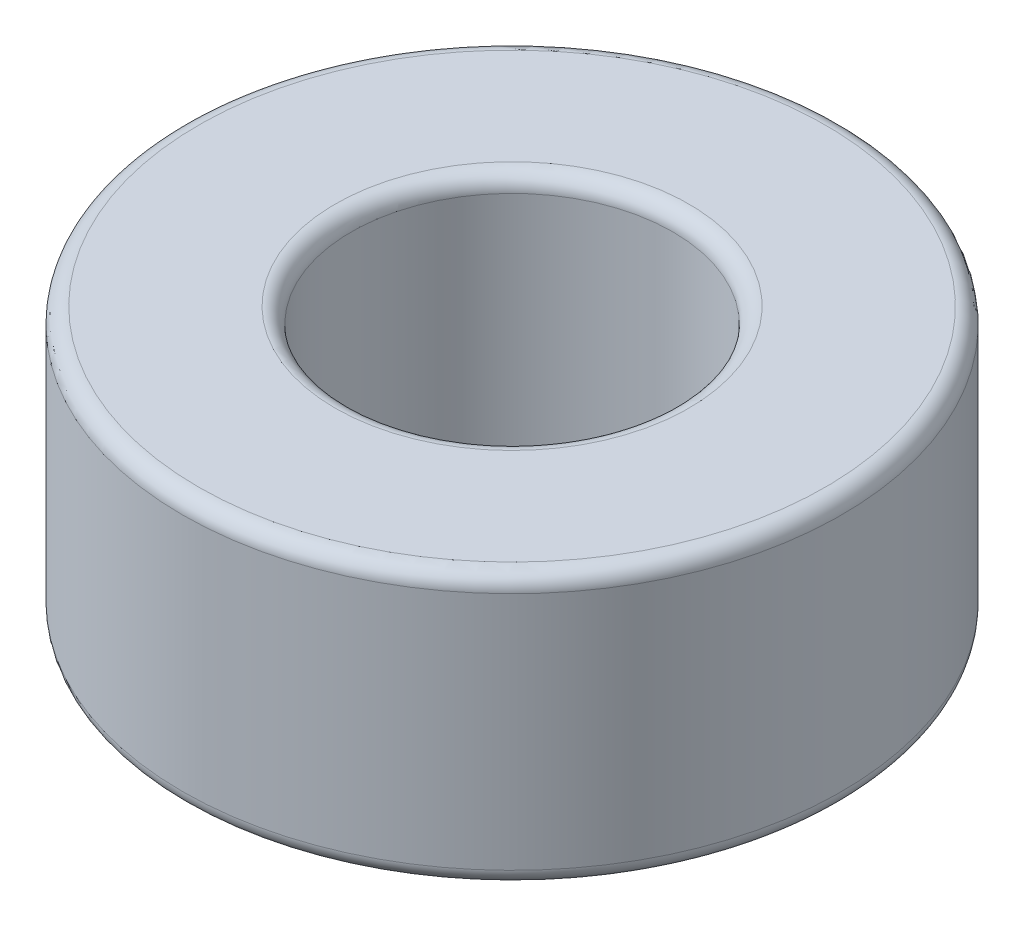
ISO-10303-21;
HEADER;
FILE_DESCRIPTION(('STEP AP214'),'2;1');
FILE_NAME('part.step','',(''),(''),'','','');
FILE_SCHEMA(('AUTOMOTIVE_DESIGN { 1 0 10303 214 1 1 1 1 }'));
ENDSEC;
DATA;
#1=APPLICATION_CONTEXT('core data for automotive mechanical design processes');
#2=APPLICATION_PROTOCOL_DEFINITION('international standard','automotive_design',2000,#1);
#3=PRODUCT_CONTEXT('',#1,'mechanical');
#4=PRODUCT('Part','Part','',(#3));
#5=PRODUCT_RELATED_PRODUCT_CATEGORY('part','',(#4));
#6=PRODUCT_DEFINITION_FORMATION('','',#4);
#7=PRODUCT_DEFINITION_CONTEXT('part definition',#1,'design');
#8=PRODUCT_DEFINITION('design','',#6,#7);
#9=PRODUCT_DEFINITION_SHAPE('','',#8);
#10=(LENGTH_UNIT() NAMED_UNIT(*) SI_UNIT(.MILLI.,.METRE.));
#11=(NAMED_UNIT(*) PLANE_ANGLE_UNIT() SI_UNIT($,.RADIAN.));
#12=(NAMED_UNIT(*) SI_UNIT($,.STERADIAN.) SOLID_ANGLE_UNIT());
#13=UNCERTAINTY_MEASURE_WITH_UNIT(LENGTH_MEASURE(1.E-05),#10,'distance_accuracy_value','');
#14=(GEOMETRIC_REPRESENTATION_CONTEXT(3) GLOBAL_UNCERTAINTY_ASSIGNED_CONTEXT((#13)) GLOBAL_UNIT_ASSIGNED_CONTEXT((#10,
#11,#12)) REPRESENTATION_CONTEXT('',''));
#15=CARTESIAN_POINT('',(0.,0.,0.));
#16=DIRECTION('',(0.,0.,1.));
#17=DIRECTION('',(1.,0.,0.));
#18=AXIS2_PLACEMENT_3D('',#15,#16,#17);
#19=CARTESIAN_POINT('',(0.,16.9,0.));
#20=DIRECTION('',(0.,1.,0.));
#21=DIRECTION('',(0.,0.,1.));
#22=AXIS2_PLACEMENT_3D('',#19,#20,#21);
#23=PLANE('',#22);
#24=CARTESIAN_POINT('',(0.,16.9,0.));
#25=DIRECTION('',(0.,1.,0.));
#26=DIRECTION('',(0.,0.,1.));
#27=AXIS2_PLACEMENT_3D('',#24,#25,#26);
#28=CIRCLE('',#27,11.);
#29=CARTESIAN_POINT('',(0.,16.9,11.));
#30=VERTEX_POINT('',#29);
#31=EDGE_CURVE('E10',#30,#30,#28,.F.);
#32=ORIENTED_EDGE('',*,*,#31,.T.);
#33=EDGE_LOOP('',(#32));
#34=FACE_BOUND('',#33,.T.);
#35=CARTESIAN_POINT('',(0.,16.9,0.));
#36=DIRECTION('',(0.,1.,0.));
#37=DIRECTION('',(0.,0.,1.));
#38=AXIS2_PLACEMENT_3D('',#35,#36,#37);
#39=CIRCLE('',#38,19.5);
#40=CARTESIAN_POINT('',(0.,16.9,19.5));
#41=VERTEX_POINT('',#40);
#42=EDGE_CURVE('E38',#41,#41,#39,.T.);
#43=ORIENTED_EDGE('',*,*,#42,.T.);
#44=EDGE_LOOP('',(#43));
#45=FACE_BOUND('',#44,.T.);
#46=ADVANCED_FACE('F31',(#34,#45),#23,.T.);
#47=CARTESIAN_POINT('',(0.,0.,0.));
#48=DIRECTION('',(0.,1.,0.));
#49=DIRECTION('',(0.,0.,1.));
#50=AXIS2_PLACEMENT_3D('',#47,#48,#49);
#51=PLANE('',#50);
#52=CARTESIAN_POINT('',(0.,0.,0.));
#53=DIRECTION('',(0.,1.,0.));
#54=DIRECTION('',(0.,0.,1.));
#55=AXIS2_PLACEMENT_3D('',#52,#53,#54);
#56=CIRCLE('',#55,11.);
#57=CARTESIAN_POINT('',(0.,0.,11.));
#58=VERTEX_POINT('',#57);
#59=EDGE_CURVE('E57',#58,#58,#56,.T.);
#60=ORIENTED_EDGE('',*,*,#59,.T.);
#61=EDGE_LOOP('',(#60));
#62=FACE_BOUND('',#61,.T.);
#63=CARTESIAN_POINT('',(0.,0.,0.));
#64=DIRECTION('',(0.,1.,0.));
#65=DIRECTION('',(0.,0.,1.));
#66=AXIS2_PLACEMENT_3D('',#63,#64,#65);
#67=CIRCLE('',#66,19.5);
#68=CARTESIAN_POINT('',(0.,0.,19.5));
#69=VERTEX_POINT('',#68);
#70=EDGE_CURVE('E60',#69,#69,#67,.F.);
#71=ORIENTED_EDGE('',*,*,#70,.T.);
#72=EDGE_LOOP('',(#71));
#73=FACE_BOUND('',#72,.T.);
#74=ADVANCED_FACE('F64',(#62,#73),#51,.F.);
#75=CARTESIAN_POINT('',(0.,16.9,0.));
#76=DIRECTION('',(0.,-1.,0.));
#77=DIRECTION('',(0.,0.,-1.));
#78=AXIS2_PLACEMENT_3D('',#75,#76,#77);
#79=CYLINDRICAL_SURFACE('',#78,20.5);
#80=CARTESIAN_POINT('',(0.,1.,0.));
#81=DIRECTION('',(0.,1.,0.));
#82=DIRECTION('',(0.,0.,1.));
#83=AXIS2_PLACEMENT_3D('',#80,#81,#82);
#84=CIRCLE('',#83,20.5);
#85=CARTESIAN_POINT('',(0.,1.,20.5));
#86=VERTEX_POINT('',#85);
#87=EDGE_CURVE('E42',#86,#86,#84,.T.);
#88=ORIENTED_EDGE('',*,*,#87,.T.);
#89=EDGE_LOOP('',(#88));
#90=FACE_BOUND('',#89,.T.);
#91=CARTESIAN_POINT('',(0.,15.9,0.));
#92=DIRECTION('',(0.,1.,0.));
#93=DIRECTION('',(0.,0.,1.));
#94=AXIS2_PLACEMENT_3D('',#91,#92,#93);
#95=CIRCLE('',#94,20.5);
#96=CARTESIAN_POINT('',(0.,15.9,20.5));
#97=VERTEX_POINT('',#96);
#98=EDGE_CURVE('E46',#97,#97,#95,.F.);
#99=ORIENTED_EDGE('',*,*,#98,.T.);
#100=EDGE_LOOP('',(#99));
#101=FACE_BOUND('',#100,.T.);
#102=ADVANCED_FACE('F74',(#90,#101),#79,.T.);
#103=CARTESIAN_POINT('',(0.,16.9,0.));
#104=DIRECTION('',(0.,-1.,0.));
#105=DIRECTION('',(0.,0.,-1.));
#106=AXIS2_PLACEMENT_3D('',#103,#104,#105);
#107=CYLINDRICAL_SURFACE('',#106,10.);
#108=CARTESIAN_POINT('',(0.,1.,0.));
#109=DIRECTION('',(0.,1.,0.));
#110=DIRECTION('',(0.,0.,1.));
#111=AXIS2_PLACEMENT_3D('',#108,#109,#110);
#112=CIRCLE('',#111,10.);
#113=CARTESIAN_POINT('',(0.,1.,10.));
#114=VERTEX_POINT('',#113);
#115=EDGE_CURVE('E51',#114,#114,#112,.F.);
#116=ORIENTED_EDGE('',*,*,#115,.T.);
#117=EDGE_LOOP('',(#116));
#118=FACE_BOUND('',#117,.T.);
#119=CARTESIAN_POINT('',(0.,15.9,0.));
#120=DIRECTION('',(0.,1.,0.));
#121=DIRECTION('',(0.,0.,1.));
#122=AXIS2_PLACEMENT_3D('',#119,#120,#121);
#123=CIRCLE('',#122,10.);
#124=CARTESIAN_POINT('',(0.,15.9,10.));
#125=VERTEX_POINT('',#124);
#126=EDGE_CURVE('E54',#125,#125,#123,.T.);
#127=ORIENTED_EDGE('',*,*,#126,.T.);
#128=EDGE_LOOP('',(#127));
#129=FACE_BOUND('',#128,.T.);
#130=ADVANCED_FACE('F77',(#118,#129),#107,.F.);
#131=CARTESIAN_POINT('',(0.,1.,0.));
#132=DIRECTION('',(0.,1.,0.));
#133=DIRECTION('',(0.,0.,1.));
#134=AXIS2_PLACEMENT_3D('',#131,#132,#133);
#135=TOROIDAL_SURFACE('',#134,11.,1.);
#136=ORIENTED_EDGE('',*,*,#115,.F.);
#137=EDGE_LOOP('',(#136));
#138=FACE_BOUND('',#137,.T.);
#139=ORIENTED_EDGE('',*,*,#59,.F.);
#140=EDGE_LOOP('',(#139));
#141=FACE_BOUND('',#140,.T.);
#142=ADVANCED_FACE('F70',(#138,#141),#135,.T.);
#143=CARTESIAN_POINT('',(0.,1.,0.));
#144=DIRECTION('',(0.,1.,0.));
#145=DIRECTION('',(0.,0.,1.));
#146=AXIS2_PLACEMENT_3D('',#143,#144,#145);
#147=TOROIDAL_SURFACE('',#146,19.5,1.);
#148=ORIENTED_EDGE('',*,*,#70,.F.);
#149=EDGE_LOOP('',(#148));
#150=FACE_BOUND('',#149,.T.);
#151=ORIENTED_EDGE('',*,*,#87,.F.);
#152=EDGE_LOOP('',(#151));
#153=FACE_BOUND('',#152,.T.);
#154=ADVANCED_FACE('F66',(#150,#153),#147,.T.);
#155=CARTESIAN_POINT('',(0.,15.9,0.));
#156=DIRECTION('',(0.,1.,0.));
#157=DIRECTION('',(0.,0.,1.));
#158=AXIS2_PLACEMENT_3D('',#155,#156,#157);
#159=TOROIDAL_SURFACE('',#158,11.,1.);
#160=ORIENTED_EDGE('',*,*,#31,.F.);
#161=EDGE_LOOP('',(#160));
#162=FACE_BOUND('',#161,.T.);
#163=ORIENTED_EDGE('',*,*,#126,.F.);
#164=EDGE_LOOP('',(#163));
#165=FACE_BOUND('',#164,.T.);
#166=ADVANCED_FACE('F69',(#162,#165),#159,.T.);
#167=CARTESIAN_POINT('',(0.,15.9,0.));
#168=DIRECTION('',(0.,1.,0.));
#169=DIRECTION('',(0.,0.,1.));
#170=AXIS2_PLACEMENT_3D('',#167,#168,#169);
#171=TOROIDAL_SURFACE('',#170,19.5,1.);
#172=ORIENTED_EDGE('',*,*,#98,.F.);
#173=EDGE_LOOP('',(#172));
#174=FACE_BOUND('',#173,.T.);
#175=ORIENTED_EDGE('',*,*,#42,.F.);
#176=EDGE_LOOP('',(#175));
#177=FACE_BOUND('',#176,.T.);
#178=ADVANCED_FACE('F33',(#174,#177),#171,.T.);
#179=CLOSED_SHELL('',(#46,#74,#102,#130,#142,#154,#166,#178));
#180=MANIFOLD_SOLID_BREP('B2',#179);
#181=ADVANCED_BREP_SHAPE_REPRESENTATION('',(#18,#180),#14);
#182=SHAPE_DEFINITION_REPRESENTATION(#9,#181);
ENDSEC;
END-ISO-10303-21;
